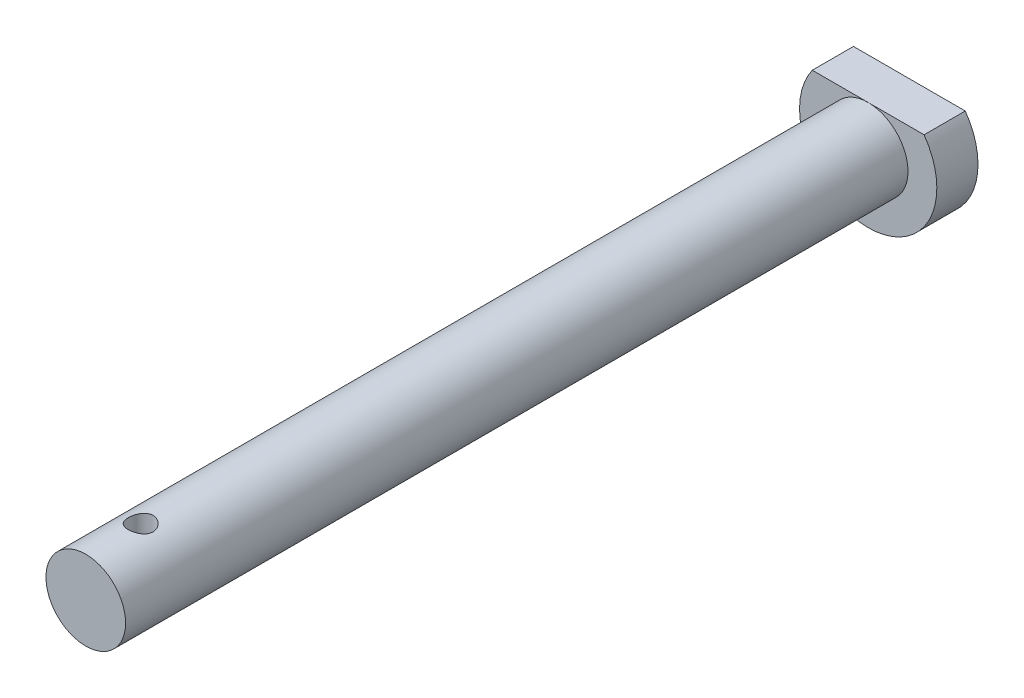
ISO-10303-21;
HEADER;
FILE_DESCRIPTION(('STEP AP214'),'2;1');
FILE_NAME('part.step','',(''),(''),'','','');
FILE_SCHEMA(('AUTOMOTIVE_DESIGN { 1 0 10303 214 1 1 1 1 }'));
ENDSEC;
DATA;
#1=APPLICATION_CONTEXT('core data for automotive mechanical design processes');
#2=APPLICATION_PROTOCOL_DEFINITION('international standard','automotive_design',2000,#1);
#3=PRODUCT_CONTEXT('',#1,'mechanical');
#4=PRODUCT('Part','Part','',(#3));
#5=PRODUCT_RELATED_PRODUCT_CATEGORY('part','',(#4));
#6=PRODUCT_DEFINITION_FORMATION('','',#4);
#7=PRODUCT_DEFINITION_CONTEXT('part definition',#1,'design');
#8=PRODUCT_DEFINITION('design','',#6,#7);
#9=PRODUCT_DEFINITION_SHAPE('','',#8);
#10=(LENGTH_UNIT() NAMED_UNIT(*) SI_UNIT(.MILLI.,.METRE.));
#11=(NAMED_UNIT(*) PLANE_ANGLE_UNIT() SI_UNIT($,.RADIAN.));
#12=(NAMED_UNIT(*) SI_UNIT($,.STERADIAN.) SOLID_ANGLE_UNIT());
#13=UNCERTAINTY_MEASURE_WITH_UNIT(LENGTH_MEASURE(1.E-05),#10,'distance_accuracy_value','');
#14=(GEOMETRIC_REPRESENTATION_CONTEXT(3) GLOBAL_UNCERTAINTY_ASSIGNED_CONTEXT((#13)) GLOBAL_UNIT_ASSIGNED_CONTEXT((#10,
#11,#12)) REPRESENTATION_CONTEXT('',''));
#15=CARTESIAN_POINT('',(0.,0.,0.));
#16=DIRECTION('',(0.,0.,1.));
#17=DIRECTION('',(1.,0.,0.));
#18=AXIS2_PLACEMENT_3D('',#15,#16,#17);
#19=CARTESIAN_POINT('',(0.,2.9,0.));
#20=DIRECTION('',(0.,1.,0.));
#21=DIRECTION('',(0.,0.,1.));
#22=AXIS2_PLACEMENT_3D('',#19,#20,#21);
#23=PLANE('',#22);
#24=DIRECTION('',(0.,0.,1.));
#25=VECTOR('',#24,1.);
#26=CARTESIAN_POINT('',(4.07308237088326,2.9,-3.));
#27=LINE('',#26,#25);
#28=CARTESIAN_POINT('',(4.07308237088326,2.9,-3.));
#29=VERTEX_POINT('',#28);
#30=CARTESIAN_POINT('',(4.07308237088326,2.9,0.));
#31=VERTEX_POINT('',#30);
#32=EDGE_CURVE('E85',#29,#31,#27,.T.);
#33=ORIENTED_EDGE('',*,*,#32,.F.);
#34=DIRECTION('',(-1.,0.,0.));
#35=VECTOR('',#34,1.);
#36=CARTESIAN_POINT('',(0.,2.9,-3.));
#37=LINE('',#36,#35);
#38=CARTESIAN_POINT('',(-4.07308237088326,2.9,-3.));
#39=VERTEX_POINT('',#38);
#40=EDGE_CURVE('E86',#29,#39,#37,.T.);
#41=ORIENTED_EDGE('',*,*,#40,.T.);
#42=DIRECTION('',(0.,0.,1.));
#43=VECTOR('',#42,1.);
#44=CARTESIAN_POINT('',(-4.07308237088326,2.9,-3.));
#45=LINE('',#44,#43);
#46=CARTESIAN_POINT('',(-4.07308237088326,2.9,0.));
#47=VERTEX_POINT('',#46);
#48=EDGE_CURVE('E83',#47,#39,#45,.F.);
#49=ORIENTED_EDGE('',*,*,#48,.F.);
#50=DIRECTION('',(-1.,0.,0.));
#51=VECTOR('',#50,1.);
#52=CARTESIAN_POINT('',(0.,2.9,0.));
#53=LINE('',#52,#51);
#54=CARTESIAN_POINT('',(0.,2.9,0.));
#55=VERTEX_POINT('',#54);
#56=EDGE_CURVE('E72',#55,#47,#53,.T.);
#57=ORIENTED_EDGE('',*,*,#56,.F.);
#58=EDGE_CURVE('E74',#31,#55,#53,.T.);
#59=ORIENTED_EDGE('',*,*,#58,.F.);
#60=EDGE_LOOP('',(#33,#41,#49,#57,#59));
#61=FACE_BOUND('',#60,.T.);
#62=ADVANCED_FACE('F33',(#61),#23,.T.);
#63=CARTESIAN_POINT('',(0.,0.,57.));
#64=DIRECTION('',(0.,0.,1.));
#65=DIRECTION('',(1.,0.,0.));
#66=AXIS2_PLACEMENT_3D('',#63,#64,#65);
#67=PLANE('',#66);
#68=CARTESIAN_POINT('',(0.,0.,57.));
#69=DIRECTION('',(0.,0.,1.));
#70=DIRECTION('',(1.,0.,0.));
#71=AXIS2_PLACEMENT_3D('',#68,#69,#70);
#72=CIRCLE('',#71,2.9);
#73=CARTESIAN_POINT('',(2.9,0.,57.));
#74=VERTEX_POINT('',#73);
#75=EDGE_CURVE('E76',#74,#74,#72,.T.);
#76=ORIENTED_EDGE('',*,*,#75,.T.);
#77=EDGE_LOOP('',(#76));
#78=FACE_BOUND('',#77,.T.);
#79=ADVANCED_FACE('F108',(#78),#67,.T.);
#80=CARTESIAN_POINT('',(0.,0.,57.));
#81=DIRECTION('',(0.,0.,-1.));
#82=DIRECTION('',(-1.,0.,0.));
#83=AXIS2_PLACEMENT_3D('',#80,#81,#82);
#84=CYLINDRICAL_SURFACE('',#83,2.9);
#85=CARTESIAN_POINT('',(0.,-2.9,53.9));
#86=CARTESIAN_POINT('',(0.0492931757415557,-2.89999972093717,53.8999996280622));
#87=CARTESIAN_POINT('',(0.0985901942586656,-2.89873130828847,53.8959369457034));
#88=CARTESIAN_POINT('',(0.195743642427587,-2.8937955664,53.8798354476981));
#89=CARTESIAN_POINT('',(0.24359972513641,-2.89012766417606,53.8677947269336));
#90=CARTESIAN_POINT('',(0.336456232833606,-2.88079384670372,53.8361815315336));
#91=CARTESIAN_POINT('',(0.381460919042364,-2.87513100003508,53.8166206200951));
#92=CARTESIAN_POINT('',(0.467551538058393,-2.86239266864545,53.7705711919));
#93=CARTESIAN_POINT('',(0.508636868515598,-2.85531696730369,53.7440816126376));
#94=CARTESIAN_POINT('',(0.586976022219221,-2.84026321843754,53.6840760050114));
#95=CARTESIAN_POINT('',(0.624093484138613,-2.83226571378867,53.6503868514532));
#96=CARTESIAN_POINT('',(0.692252817664866,-2.81638301088383,53.5773070900323));
#97=CARTESIAN_POINT('',(0.723293577701322,-2.80849783341925,53.5379154413383));
#98=CARTESIAN_POINT('',(0.779153939010954,-2.7935243071746,53.4533730604681));
#99=CARTESIAN_POINT('',(0.803803876324438,-2.78646000196046,53.4081055631098));
#100=CARTESIAN_POINT('',(0.845084715410564,-2.77422038936372,53.3138130008238));
#101=CARTESIAN_POINT('',(0.861717696623773,-2.76904459222406,53.2647889141091));
#102=CARTESIAN_POINT('',(0.88599477909076,-2.76137140946372,53.1659122331764));
#103=CARTESIAN_POINT('',(0.893891561143184,-2.75879892708712,53.1161276684066));
#104=CARTESIAN_POINT('',(0.901261428315877,-2.75640059477203,53.0158789419424));
#105=CARTESIAN_POINT('',(0.900736717670946,-2.75657402612009,52.965414961533));
#106=CARTESIAN_POINT('',(0.891476271370606,-2.75958159367971,52.8673238238415));
#107=CARTESIAN_POINT('',(0.883060926853588,-2.76231190502149,52.819662701618));
#108=CARTESIAN_POINT('',(0.858777243843435,-2.76995705014631,52.7264653040355));
#109=CARTESIAN_POINT('',(0.842908123189737,-2.77487211318295,52.6809292522217));
#110=CARTESIAN_POINT('',(0.803939399781582,-2.78641310286464,52.5925077881552));
#111=CARTESIAN_POINT('',(0.780738616506818,-2.79306272835418,52.5496701936321));
#112=CARTESIAN_POINT('',(0.727835431487886,-2.80731264666723,52.4683907337351));
#113=CARTESIAN_POINT('',(0.698131360405945,-2.81491318336635,52.4299500008618));
#114=CARTESIAN_POINT('',(0.63148928623927,-2.83062584939865,52.3567431140264));
#115=CARTESIAN_POINT('',(0.59428654467572,-2.83874563325825,52.3222191626541));
#116=CARTESIAN_POINT('',(0.514518453196474,-2.8542809323309,52.2598416719714));
#117=CARTESIAN_POINT('',(0.471952717163584,-2.86169639676788,52.2319886133616));
#118=CARTESIAN_POINT('',(0.382204810923906,-2.87506357659219,52.1835824515277));
#119=CARTESIAN_POINT('',(0.334990028392796,-2.88100374472077,52.1630864095606));
#120=CARTESIAN_POINT('',(0.237555721451469,-2.89066770879921,52.1303991997986));
#121=CARTESIAN_POINT('',(0.187337101267233,-2.89439216807123,52.1182055463394));
#122=CARTESIAN_POINT('',(0.0873770674008531,-2.89909865037031,52.1028801902196));
#123=CARTESIAN_POINT('',(0.0376905297953943,-2.90017987095835,52.0994205399745));
#124=CARTESIAN_POINT('',(-0.0615580930832937,-2.89977102018995,52.1007377059703));
#125=CARTESIAN_POINT('',(-0.111120195232684,-2.8982813187346,52.1055133373291));
#126=CARTESIAN_POINT('',(-0.207452871056923,-2.89296314976922,52.1229018884347));
#127=CARTESIAN_POINT('',(-0.254262071436738,-2.88919276995172,52.135320283688));
#128=CARTESIAN_POINT('',(-0.345119928401141,-2.87975351329884,52.1674050719232));
#129=CARTESIAN_POINT('',(-0.389168244712594,-2.87408440299299,52.1870723562682));
#130=CARTESIAN_POINT('',(-0.474437835875942,-2.86126089407265,52.2336284643668));
#131=CARTESIAN_POINT('',(-0.515565052187016,-2.85407390874808,52.2606803387783));
#132=CARTESIAN_POINT('',(-0.5928065154943,-2.83903705710556,52.3210416670958));
#133=CARTESIAN_POINT('',(-0.628919416193974,-2.83118701366913,52.3543527959249));
#134=CARTESIAN_POINT('',(-0.696570359869242,-2.81532330340815,52.4278292955033));
#135=CARTESIAN_POINT('',(-0.727874728109914,-2.80731521508189,52.4682115039577));
#136=CARTESIAN_POINT('',(-0.783282799554722,-2.79236360846534,52.5538299454889));
#137=CARTESIAN_POINT('',(-0.807386631452328,-2.78542007114966,52.5990660917927));
#138=CARTESIAN_POINT('',(-0.847556633591766,-2.77346136074998,52.6930053519625));
#139=CARTESIAN_POINT('',(-0.863655143947934,-2.76843844801008,52.7416935931681));
#140=CARTESIAN_POINT('',(-0.887369287704318,-2.76092982095482,52.8412771016388));
#141=CARTESIAN_POINT('',(-0.894988091895235,-2.75844315829631,52.8921715365476));
#142=CARTESIAN_POINT('',(-0.901300946773511,-2.75638646600152,52.9922826183751));
#143=CARTESIAN_POINT('',(-0.900377907928938,-2.75669129388111,53.0414728500068));
#144=CARTESIAN_POINT('',(-0.890555826231342,-2.75987977643098,53.1389609602298));
#145=CARTESIAN_POINT('',(-0.881657145929512,-2.76276331388003,53.1872588792812));
#146=CARTESIAN_POINT('',(-0.856391135585142,-2.77069747310909,53.2809169645925));
#147=CARTESIAN_POINT('',(-0.840131942412026,-2.77571665705349,53.3263091664356));
#148=CARTESIAN_POINT('',(-0.800691410945576,-2.78734892982883,53.4137575356498));
#149=CARTESIAN_POINT('',(-0.7775086786181,-2.79396233960067,53.4558130290241));
#150=CARTESIAN_POINT('',(-0.723830830281812,-2.80835687847747,53.537153783211));
#151=CARTESIAN_POINT('',(-0.693087689398389,-2.81617326449553,53.5762691160433));
#152=CARTESIAN_POINT('',(-0.625599885659739,-2.83192934420486,53.6489096790062));
#153=CARTESIAN_POINT('',(-0.588853626207568,-2.83986907019005,53.6824334171825));
#154=CARTESIAN_POINT('',(-0.508985649734599,-2.85528241197611,53.7440137091445));
#155=CARTESIAN_POINT('',(-0.465697368480213,-2.86273293889771,53.7718606482024));
#156=CARTESIAN_POINT('',(-0.37482266715368,-2.87604097848543,53.8198447490166));
#157=CARTESIAN_POINT('',(-0.327238003480348,-2.88189913823229,53.8399850438367));
#158=CARTESIAN_POINT('',(-0.23347124904959,-2.89093586089642,53.8704610416227));
#159=CARTESIAN_POINT('',(-0.187537577749392,-2.89430565096269,53.8815065757222));
#160=CARTESIAN_POINT('',(-0.09440361233289,-2.89883763796571,53.8962755160185));
#161=CARTESIAN_POINT('',(-0.0472035681063119,-2.90000026723296,53.9000003561708));
#162=CARTESIAN_POINT('',(0.,-2.9,53.9));
#163=B_SPLINE_CURVE_WITH_KNOTS('',3,(#85,#86,#87,#88,#89,#90,#91,#92,#93,#94,#95,#96,#97,#98,
#99,#100,#101,#102,#103,#104,#105,#106,#107,#108,#109,#110,#111,#112,#113,#114,#115,#116,#117,
#118,#119,#120,#121,#122,#123,#124,#125,#126,#127,#128,#129,#130,#131,#132,#133,#134,#135,#136,
#137,#138,#139,#140,#141,#142,#143,#144,#145,#146,#147,#148,#149,#150,#151,#152,#153,#154,#155,
#156,#157,#158,#159,#160,#161,#162),.UNSPECIFIED.,.T.,.F.,(4,2,2,2,2,2,2,2,2,2,2,2,2,2,2,2,2,2,
2,2,2,2,2,2,2,2,2,2,2,2,2,2,2,2,2,2,2,2,4),(0.,0.147706042500872,0.295447369228166,
0.4429624286598,0.590500122688185,0.742093264681078,0.893714110735046,1.04902249218492,
1.20429056799099,1.35493975147179,1.50554950479836,1.65029710252409,1.79505989270562,
1.94191479520866,2.08880743838558,2.24228972874652,2.39578307562676,2.5504424314322,
2.70505546315997,2.85377036748442,3.00246387667576,3.14752094693161,3.29259586015275,
3.44117712898208,3.58979821366189,3.74422210536487,3.89864323692127,4.0524353603054,
4.20616995732869,4.35304759077576,4.49991854789957,4.64469846497236,4.78950755272934,
4.9399143546426,5.09036122425686,5.24562904290609,5.40083367165015,5.5423059594376,
5.68375053329625),.UNSPECIFIED.);
#164=CARTESIAN_POINT('',(0.,-2.9,53.9));
#165=VERTEX_POINT('',#164);
#166=EDGE_CURVE('E36',#165,#165,#163,.T.);
#167=ORIENTED_EDGE('',*,*,#166,.T.);
#168=EDGE_LOOP('',(#167));
#169=FACE_BOUND('',#168,.T.);
#170=CARTESIAN_POINT('',(0.,2.9,53.9));
#171=CARTESIAN_POINT('',(-0.0492931757415556,2.89999972093717,53.8999996280622));
#172=CARTESIAN_POINT('',(-0.0985901942586655,2.89873130828847,53.8959369457034));
#173=CARTESIAN_POINT('',(-0.195743642427587,2.8937955664,53.8798354476981));
#174=CARTESIAN_POINT('',(-0.24359972513641,2.89012766417606,53.8677947269336));
#175=CARTESIAN_POINT('',(-0.336456232833606,2.88079384670372,53.8361815315336));
#176=CARTESIAN_POINT('',(-0.381460919042364,2.87513100003508,53.8166206200951));
#177=CARTESIAN_POINT('',(-0.467551538058393,2.86239266864545,53.7705711919));
#178=CARTESIAN_POINT('',(-0.508636868515598,2.85531696730369,53.7440816126376));
#179=CARTESIAN_POINT('',(-0.586976022219221,2.84026321843754,53.6840760050114));
#180=CARTESIAN_POINT('',(-0.624093484138613,2.83226571378867,53.6503868514532));
#181=CARTESIAN_POINT('',(-0.692252817664866,2.81638301088383,53.5773070900323));
#182=CARTESIAN_POINT('',(-0.723293577701322,2.80849783341925,53.5379154413383));
#183=CARTESIAN_POINT('',(-0.779153939010954,2.7935243071746,53.4533730604681));
#184=CARTESIAN_POINT('',(-0.803803876324438,2.78646000196046,53.4081055631098));
#185=CARTESIAN_POINT('',(-0.845084715410564,2.77422038936372,53.3138130008238));
#186=CARTESIAN_POINT('',(-0.861717696623773,2.76904459222406,53.2647889141091));
#187=CARTESIAN_POINT('',(-0.88599477909076,2.76137140946372,53.1659122331764));
#188=CARTESIAN_POINT('',(-0.893891561143184,2.75879892708712,53.1161276684066));
#189=CARTESIAN_POINT('',(-0.901261428315877,2.75640059477203,53.0158789419424));
#190=CARTESIAN_POINT('',(-0.900736717670946,2.75657402612009,52.965414961533));
#191=CARTESIAN_POINT('',(-0.891476271370606,2.75958159367971,52.8673238238415));
#192=CARTESIAN_POINT('',(-0.883060926853588,2.76231190502149,52.819662701618));
#193=CARTESIAN_POINT('',(-0.858777243843435,2.76995705014631,52.7264653040355));
#194=CARTESIAN_POINT('',(-0.842908123189737,2.77487211318295,52.6809292522217));
#195=CARTESIAN_POINT('',(-0.803939399781582,2.78641310286464,52.5925077881552));
#196=CARTESIAN_POINT('',(-0.780738616506818,2.79306272835418,52.5496701936321));
#197=CARTESIAN_POINT('',(-0.727835431487886,2.80731264666723,52.4683907337351));
#198=CARTESIAN_POINT('',(-0.698131360405945,2.81491318336635,52.4299500008618));
#199=CARTESIAN_POINT('',(-0.63148928623927,2.83062584939865,52.3567431140264));
#200=CARTESIAN_POINT('',(-0.59428654467572,2.83874563325825,52.3222191626541));
#201=CARTESIAN_POINT('',(-0.514518453196474,2.8542809323309,52.2598416719714));
#202=CARTESIAN_POINT('',(-0.471952717163584,2.86169639676788,52.2319886133616));
#203=CARTESIAN_POINT('',(-0.382204810923906,2.87506357659219,52.1835824515277));
#204=CARTESIAN_POINT('',(-0.334990028392796,2.88100374472077,52.1630864095606));
#205=CARTESIAN_POINT('',(-0.237555721451469,2.89066770879921,52.1303991997986));
#206=CARTESIAN_POINT('',(-0.187337101267233,2.89439216807123,52.1182055463394));
#207=CARTESIAN_POINT('',(-0.0873770674008531,2.89909865037031,52.1028801902196));
#208=CARTESIAN_POINT('',(-0.0376905297953943,2.90017987095835,52.0994205399745));
#209=CARTESIAN_POINT('',(0.0615580930832937,2.89977102018995,52.1007377059703));
#210=CARTESIAN_POINT('',(0.111120195232684,2.8982813187346,52.1055133373291));
#211=CARTESIAN_POINT('',(0.207452871056923,2.89296314976922,52.1229018884347));
#212=CARTESIAN_POINT('',(0.254262071436738,2.88919276995172,52.135320283688));
#213=CARTESIAN_POINT('',(0.345119928401141,2.87975351329884,52.1674050719232));
#214=CARTESIAN_POINT('',(0.389168244712594,2.87408440299299,52.1870723562682));
#215=CARTESIAN_POINT('',(0.474437835875942,2.86126089407265,52.2336284643668));
#216=CARTESIAN_POINT('',(0.515565052187016,2.85407390874808,52.2606803387783));
#217=CARTESIAN_POINT('',(0.5928065154943,2.83903705710556,52.3210416670958));
#218=CARTESIAN_POINT('',(0.628919416193974,2.83118701366913,52.3543527959249));
#219=CARTESIAN_POINT('',(0.696570359869242,2.81532330340815,52.4278292955033));
#220=CARTESIAN_POINT('',(0.727874728109914,2.80731521508189,52.4682115039577));
#221=CARTESIAN_POINT('',(0.783282799554722,2.79236360846534,52.5538299454889));
#222=CARTESIAN_POINT('',(0.807386631452328,2.78542007114966,52.5990660917927));
#223=CARTESIAN_POINT('',(0.847556633591766,2.77346136074998,52.6930053519625));
#224=CARTESIAN_POINT('',(0.863655143947934,2.76843844801008,52.7416935931681));
#225=CARTESIAN_POINT('',(0.887369287704318,2.76092982095482,52.8412771016388));
#226=CARTESIAN_POINT('',(0.894988091895235,2.75844315829631,52.8921715365476));
#227=CARTESIAN_POINT('',(0.901300946773511,2.75638646600152,52.9922826183751));
#228=CARTESIAN_POINT('',(0.900377907928938,2.75669129388111,53.0414728500068));
#229=CARTESIAN_POINT('',(0.890555826231342,2.75987977643098,53.1389609602298));
#230=CARTESIAN_POINT('',(0.881657145929512,2.76276331388003,53.1872588792812));
#231=CARTESIAN_POINT('',(0.856391135585142,2.77069747310909,53.2809169645925));
#232=CARTESIAN_POINT('',(0.840131942412026,2.77571665705349,53.3263091664356));
#233=CARTESIAN_POINT('',(0.800691410945576,2.78734892982883,53.4137575356498));
#234=CARTESIAN_POINT('',(0.7775086786181,2.79396233960067,53.4558130290241));
#235=CARTESIAN_POINT('',(0.723830830281812,2.80835687847747,53.537153783211));
#236=CARTESIAN_POINT('',(0.693087689398389,2.81617326449553,53.5762691160433));
#237=CARTESIAN_POINT('',(0.625599885659739,2.83192934420486,53.6489096790062));
#238=CARTESIAN_POINT('',(0.588853626207568,2.83986907019005,53.6824334171825));
#239=CARTESIAN_POINT('',(0.508985649734599,2.85528241197611,53.7440137091445));
#240=CARTESIAN_POINT('',(0.465697368480213,2.86273293889771,53.7718606482024));
#241=CARTESIAN_POINT('',(0.37482266715368,2.87604097848543,53.8198447490166));
#242=CARTESIAN_POINT('',(0.327238003480348,2.88189913823229,53.8399850438367));
#243=CARTESIAN_POINT('',(0.23347124904959,2.89093586089642,53.8704610416227));
#244=CARTESIAN_POINT('',(0.187537577749392,2.89430565096269,53.8815065757222));
#245=CARTESIAN_POINT('',(0.09440361233289,2.89883763796571,53.8962755160185));
#246=CARTESIAN_POINT('',(0.0472035681063119,2.90000026723296,53.9000003561708));
#247=CARTESIAN_POINT('',(0.,2.9,53.9));
#248=B_SPLINE_CURVE_WITH_KNOTS('',3,(#170,#171,#172,#173,#174,#175,#176,#177,#178,#179,#180,
#181,#182,#183,#184,#185,#186,#187,#188,#189,#190,#191,#192,#193,#194,#195,#196,#197,#198,#199,
#200,#201,#202,#203,#204,#205,#206,#207,#208,#209,#210,#211,#212,#213,#214,#215,#216,#217,#218,
#219,#220,#221,#222,#223,#224,#225,#226,#227,#228,#229,#230,#231,#232,#233,#234,#235,#236,#237,
#238,#239,#240,#241,#242,#243,#244,#245,#246,#247),.UNSPECIFIED.,.T.,.F.,(4,2,2,2,2,2,2,2,2,2,2,
2,2,2,2,2,2,2,2,2,2,2,2,2,2,2,2,2,2,2,2,2,2,2,2,2,2,2,4),(0.,0.147706042500872,
0.295447369228166,0.4429624286598,0.590500122688185,0.742093264681078,0.893714110735046,
1.04902249218492,1.20429056799099,1.35493975147179,1.50554950479836,1.65029710252409,
1.79505989270562,1.94191479520866,2.08880743838558,2.24228972874652,2.39578307562676,
2.5504424314322,2.70505546315997,2.85377036748442,3.00246387667576,3.14752094693161,
3.29259586015275,3.44117712898208,3.58979821366189,3.74422210536487,3.89864323692127,
4.0524353603054,4.20616995732869,4.35304759077576,4.49991854789957,4.64469846497236,
4.78950755272934,4.9399143546426,5.09036122425686,5.24562904290609,5.40083367165015,
5.5423059594376,5.68375053329625),.UNSPECIFIED.);
#249=CARTESIAN_POINT('',(0.,2.9,53.9));
#250=VERTEX_POINT('',#249);
#251=EDGE_CURVE('E12',#250,#250,#248,.T.);
#252=ORIENTED_EDGE('',*,*,#251,.T.);
#253=EDGE_LOOP('',(#252));
#254=FACE_BOUND('',#253,.T.);
#255=CARTESIAN_POINT('',(0.,0.,0.));
#256=DIRECTION('',(0.,0.,1.));
#257=DIRECTION('',(1.,0.,0.));
#258=AXIS2_PLACEMENT_3D('',#255,#256,#257);
#259=CIRCLE('',#258,2.9);
#260=EDGE_CURVE('E69',#55,#55,#259,.T.);
#261=ORIENTED_EDGE('',*,*,#260,.T.);
#262=EDGE_LOOP('',(#261));
#263=FACE_BOUND('',#262,.T.);
#264=ORIENTED_EDGE('',*,*,#75,.F.);
#265=EDGE_LOOP('',(#264));
#266=FACE_BOUND('',#265,.T.);
#267=ADVANCED_FACE('F92',(#169,#254,#263,#266),#84,.T.);
#268=CARTESIAN_POINT('',(0.,0.,-3.));
#269=DIRECTION('',(0.,0.,1.));
#270=DIRECTION('',(1.,0.,0.));
#271=AXIS2_PLACEMENT_3D('',#268,#269,#270);
#272=CYLINDRICAL_SURFACE('',#271,5.);
#273=CARTESIAN_POINT('',(0.,0.,0.));
#274=DIRECTION('',(0.,0.,1.));
#275=DIRECTION('',(1.,0.,0.));
#276=AXIS2_PLACEMENT_3D('',#273,#274,#275);
#277=CIRCLE('',#276,5.);
#278=EDGE_CURVE('E45',#47,#31,#277,.T.);
#279=ORIENTED_EDGE('',*,*,#278,.F.);
#280=ORIENTED_EDGE('',*,*,#48,.T.);
#281=CARTESIAN_POINT('',(0.,0.,-3.));
#282=DIRECTION('',(0.,0.,1.));
#283=DIRECTION('',(1.,0.,0.));
#284=AXIS2_PLACEMENT_3D('',#281,#282,#283);
#285=CIRCLE('',#284,5.);
#286=EDGE_CURVE('E51',#39,#29,#285,.T.);
#287=ORIENTED_EDGE('',*,*,#286,.T.);
#288=ORIENTED_EDGE('',*,*,#32,.T.);
#289=EDGE_LOOP('',(#279,#280,#287,#288));
#290=FACE_BOUND('',#289,.T.);
#291=ADVANCED_FACE('F115',(#290),#272,.T.);
#292=CARTESIAN_POINT('',(0.,0.,0.));
#293=DIRECTION('',(0.,0.,1.));
#294=DIRECTION('',(1.,0.,0.));
#295=AXIS2_PLACEMENT_3D('',#292,#293,#294);
#296=PLANE('',#295);
#297=ORIENTED_EDGE('',*,*,#278,.T.);
#298=ORIENTED_EDGE('',*,*,#58,.T.);
#299=ORIENTED_EDGE('',*,*,#260,.F.);
#300=ORIENTED_EDGE('',*,*,#56,.T.);
#301=EDGE_LOOP('',(#297,#298,#299,#300));
#302=FACE_BOUND('',#301,.T.);
#303=ADVANCED_FACE('F70',(#302),#296,.T.);
#304=CARTESIAN_POINT('',(0.,0.,-3.));
#305=DIRECTION('',(0.,0.,1.));
#306=DIRECTION('',(1.,0.,0.));
#307=AXIS2_PLACEMENT_3D('',#304,#305,#306);
#308=PLANE('',#307);
#309=ORIENTED_EDGE('',*,*,#40,.F.);
#310=ORIENTED_EDGE('',*,*,#286,.F.);
#311=EDGE_LOOP('',(#309,#310));
#312=FACE_BOUND('',#311,.T.);
#313=ADVANCED_FACE('F98',(#312),#308,.F.);
#314=CARTESIAN_POINT('',(0.,-5.,53.));
#315=DIRECTION('',(0.,1.,0.));
#316=DIRECTION('',(0.,0.,1.));
#317=AXIS2_PLACEMENT_3D('',#314,#315,#316);
#318=CYLINDRICAL_SURFACE('',#317,0.899999999999998);
#319=ORIENTED_EDGE('',*,*,#166,.F.);
#320=EDGE_LOOP('',(#319));
#321=FACE_BOUND('',#320,.T.);
#322=ORIENTED_EDGE('',*,*,#251,.F.);
#323=EDGE_LOOP('',(#322));
#324=FACE_BOUND('',#323,.T.);
#325=ADVANCED_FACE('F95',(#321,#324),#318,.F.);
#326=CLOSED_SHELL('',(#62,#79,#267,#291,#303,#313,#325));
#327=MANIFOLD_SOLID_BREP('B2',#326);
#328=ADVANCED_BREP_SHAPE_REPRESENTATION('',(#18,#327),#14);
#329=SHAPE_DEFINITION_REPRESENTATION(#9,#328);
ENDSEC;
END-ISO-10303-21;
